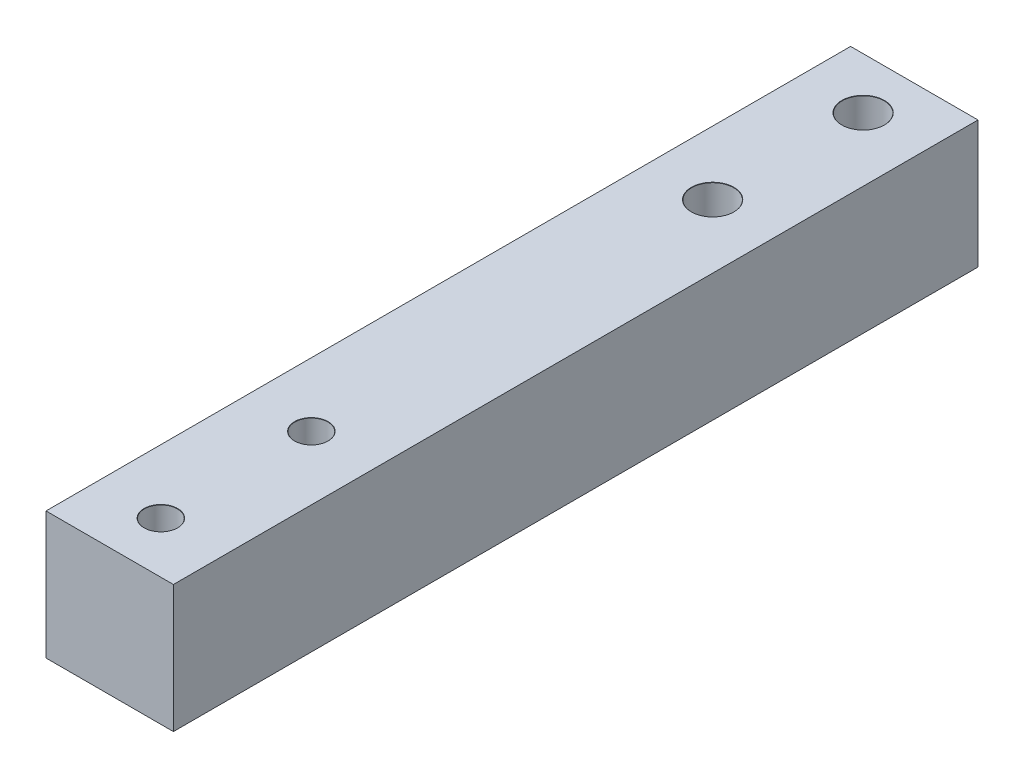
ISO-10303-21;
HEADER;
FILE_DESCRIPTION(('STEP AP214'),'2;1');
FILE_NAME('part.step','',(''),(''),'','','');
FILE_SCHEMA(('AUTOMOTIVE_DESIGN { 1 0 10303 214 1 1 1 1 }'));
ENDSEC;
DATA;
#1=APPLICATION_CONTEXT('core data for automotive mechanical design processes');
#2=APPLICATION_PROTOCOL_DEFINITION('international standard','automotive_design',2000,#1);
#3=PRODUCT_CONTEXT('',#1,'mechanical');
#4=PRODUCT('Part','Part','',(#3));
#5=PRODUCT_RELATED_PRODUCT_CATEGORY('part','',(#4));
#6=PRODUCT_DEFINITION_FORMATION('','',#4);
#7=PRODUCT_DEFINITION_CONTEXT('part definition',#1,'design');
#8=PRODUCT_DEFINITION('design','',#6,#7);
#9=PRODUCT_DEFINITION_SHAPE('','',#8);
#10=(LENGTH_UNIT() NAMED_UNIT(*) SI_UNIT(.MILLI.,.METRE.));
#11=(NAMED_UNIT(*) PLANE_ANGLE_UNIT() SI_UNIT($,.RADIAN.));
#12=(NAMED_UNIT(*) SI_UNIT($,.STERADIAN.) SOLID_ANGLE_UNIT());
#13=UNCERTAINTY_MEASURE_WITH_UNIT(LENGTH_MEASURE(1.E-05),#10,'distance_accuracy_value','');
#14=(GEOMETRIC_REPRESENTATION_CONTEXT(3) GLOBAL_UNCERTAINTY_ASSIGNED_CONTEXT((#13)) GLOBAL_UNIT_ASSIGNED_CONTEXT((#10,
#11,#12)) REPRESENTATION_CONTEXT('',''));
#15=CARTESIAN_POINT('',(0.,0.,0.));
#16=DIRECTION('',(0.,0.,1.));
#17=DIRECTION('',(1.,0.,0.));
#18=AXIS2_PLACEMENT_3D('',#15,#16,#17);
#19=CARTESIAN_POINT('',(-6.35,-6.35,80.2));
#20=DIRECTION('',(1.,0.,0.));
#21=DIRECTION('',(0.,0.,-1.));
#22=AXIS2_PLACEMENT_3D('',#19,#20,#21);
#23=PLANE('',#22);
#24=DIRECTION('',(0.,-1.,0.));
#25=VECTOR('',#24,1.);
#26=CARTESIAN_POINT('',(-6.35,-6.35,0.));
#27=LINE('',#26,#25);
#28=CARTESIAN_POINT('',(-6.35,6.35,0.));
#29=VERTEX_POINT('',#28);
#30=CARTESIAN_POINT('',(-6.35,-6.35,0.));
#31=VERTEX_POINT('',#30);
#32=EDGE_CURVE('E97',#29,#31,#27,.T.);
#33=ORIENTED_EDGE('',*,*,#32,.T.);
#34=DIRECTION('',(0.,0.,-1.));
#35=VECTOR('',#34,1.);
#36=CARTESIAN_POINT('',(-6.35,-6.35,80.2));
#37=LINE('',#36,#35);
#38=CARTESIAN_POINT('',(-6.35,-6.35,80.2));
#39=VERTEX_POINT('',#38);
#40=EDGE_CURVE('E11',#39,#31,#37,.T.);
#41=ORIENTED_EDGE('',*,*,#40,.F.);
#42=DIRECTION('',(0.,-1.,0.));
#43=VECTOR('',#42,1.);
#44=CARTESIAN_POINT('',(-6.35,-6.35,80.2));
#45=LINE('',#44,#43);
#46=CARTESIAN_POINT('',(-6.35,6.35,80.2));
#47=VERTEX_POINT('',#46);
#48=EDGE_CURVE('E85',#47,#39,#45,.T.);
#49=ORIENTED_EDGE('',*,*,#48,.F.);
#50=DIRECTION('',(0.,0.,-1.));
#51=VECTOR('',#50,1.);
#52=CARTESIAN_POINT('',(-6.35,6.35,80.2));
#53=LINE('',#52,#51);
#54=EDGE_CURVE('E93',#47,#29,#53,.T.);
#55=ORIENTED_EDGE('',*,*,#54,.T.);
#56=EDGE_LOOP('',(#33,#41,#49,#55));
#57=FACE_BOUND('',#56,.T.);
#58=ADVANCED_FACE('F34',(#57),#23,.F.);
#59=CARTESIAN_POINT('',(6.35,-6.35,80.2));
#60=DIRECTION('',(0.,1.,0.));
#61=DIRECTION('',(-1.,0.,0.));
#62=AXIS2_PLACEMENT_3D('',#59,#60,#61);
#63=PLANE('',#62);
#64=CARTESIAN_POINT('',(0.,-6.35,5.1));
#65=DIRECTION('',(0.,1.,0.));
#66=DIRECTION('',(0.,0.,1.));
#67=AXIS2_PLACEMENT_3D('',#64,#65,#66);
#68=CIRCLE('',#67,2.1);
#69=CARTESIAN_POINT('',(0.,-6.35,7.2));
#70=VERTEX_POINT('',#69);
#71=EDGE_CURVE('E137',#70,#70,#68,.T.);
#72=ORIENTED_EDGE('',*,*,#71,.T.);
#73=EDGE_LOOP('',(#72));
#74=FACE_BOUND('',#73,.T.);
#75=CARTESIAN_POINT('',(0.,-6.35,20.1));
#76=DIRECTION('',(0.,1.,0.));
#77=DIRECTION('',(0.,0.,1.));
#78=AXIS2_PLACEMENT_3D('',#75,#76,#77);
#79=CIRCLE('',#78,2.1);
#80=CARTESIAN_POINT('',(0.,-6.35,22.2));
#81=VERTEX_POINT('',#80);
#82=EDGE_CURVE('E128',#81,#81,#79,.T.);
#83=ORIENTED_EDGE('',*,*,#82,.T.);
#84=EDGE_LOOP('',(#83));
#85=FACE_BOUND('',#84,.T.);
#86=CARTESIAN_POINT('',(0.,-6.35,60.1));
#87=DIRECTION('',(0.,1.,0.));
#88=DIRECTION('',(0.,0.,1.));
#89=AXIS2_PLACEMENT_3D('',#86,#87,#88);
#90=CIRCLE('',#89,1.65);
#91=CARTESIAN_POINT('',(0.,-6.35,61.75));
#92=VERTEX_POINT('',#91);
#93=EDGE_CURVE('E119',#92,#92,#90,.T.);
#94=ORIENTED_EDGE('',*,*,#93,.T.);
#95=EDGE_LOOP('',(#94));
#96=FACE_BOUND('',#95,.T.);
#97=CARTESIAN_POINT('',(0.,-6.35,75.1));
#98=DIRECTION('',(0.,1.,0.));
#99=DIRECTION('',(0.,0.,1.));
#100=AXIS2_PLACEMENT_3D('',#97,#98,#99);
#101=CIRCLE('',#100,1.65);
#102=CARTESIAN_POINT('',(0.,-6.35,76.75));
#103=VERTEX_POINT('',#102);
#104=EDGE_CURVE('E100',#103,#103,#101,.T.);
#105=ORIENTED_EDGE('',*,*,#104,.T.);
#106=EDGE_LOOP('',(#105));
#107=FACE_BOUND('',#106,.T.);
#108=DIRECTION('',(1.,0.,0.));
#109=VECTOR('',#108,1.);
#110=CARTESIAN_POINT('',(6.35,-6.35,0.));
#111=LINE('',#110,#109);
#112=CARTESIAN_POINT('',(6.35,-6.35,0.));
#113=VERTEX_POINT('',#112);
#114=EDGE_CURVE('E89',#31,#113,#111,.T.);
#115=ORIENTED_EDGE('',*,*,#114,.T.);
#116=DIRECTION('',(0.,0.,-1.));
#117=VECTOR('',#116,1.);
#118=CARTESIAN_POINT('',(6.35,-6.35,80.2));
#119=LINE('',#118,#117);
#120=CARTESIAN_POINT('',(6.35,-6.35,80.2));
#121=VERTEX_POINT('',#120);
#122=EDGE_CURVE('E42',#121,#113,#119,.T.);
#123=ORIENTED_EDGE('',*,*,#122,.F.);
#124=DIRECTION('',(1.,0.,0.));
#125=VECTOR('',#124,1.);
#126=CARTESIAN_POINT('',(6.35,-6.35,80.2));
#127=LINE('',#126,#125);
#128=EDGE_CURVE('E80',#39,#121,#127,.T.);
#129=ORIENTED_EDGE('',*,*,#128,.F.);
#130=ORIENTED_EDGE('',*,*,#40,.T.);
#131=EDGE_LOOP('',(#115,#123,#129,#130));
#132=FACE_BOUND('',#131,.T.);
#133=ADVANCED_FACE('F88',(#74,#85,#96,#107,#132),#63,.F.);
#134=CARTESIAN_POINT('',(6.35,-6.35,80.2));
#135=DIRECTION('',(-1.,0.,0.));
#136=DIRECTION('',(0.,0.,1.));
#137=AXIS2_PLACEMENT_3D('',#134,#135,#136);
#138=PLANE('',#137);
#139=DIRECTION('',(0.,1.,0.));
#140=VECTOR('',#139,1.);
#141=CARTESIAN_POINT('',(6.35,-6.35,0.));
#142=LINE('',#141,#140);
#143=CARTESIAN_POINT('',(6.35,6.35,0.));
#144=VERTEX_POINT('',#143);
#145=EDGE_CURVE('E67',#113,#144,#142,.T.);
#146=ORIENTED_EDGE('',*,*,#145,.T.);
#147=DIRECTION('',(0.,0.,-1.));
#148=VECTOR('',#147,1.);
#149=CARTESIAN_POINT('',(6.35,6.35,80.2));
#150=LINE('',#149,#148);
#151=CARTESIAN_POINT('',(6.35,6.35,80.2));
#152=VERTEX_POINT('',#151);
#153=EDGE_CURVE('E90',#152,#144,#150,.T.);
#154=ORIENTED_EDGE('',*,*,#153,.F.);
#155=DIRECTION('',(0.,1.,0.));
#156=VECTOR('',#155,1.);
#157=CARTESIAN_POINT('',(6.35,-6.35,80.2));
#158=LINE('',#157,#156);
#159=EDGE_CURVE('E83',#121,#152,#158,.T.);
#160=ORIENTED_EDGE('',*,*,#159,.F.);
#161=ORIENTED_EDGE('',*,*,#122,.T.);
#162=EDGE_LOOP('',(#146,#154,#160,#161));
#163=FACE_BOUND('',#162,.T.);
#164=ADVANCED_FACE('F91',(#163),#138,.F.);
#165=CARTESIAN_POINT('',(6.35,6.35,80.2));
#166=DIRECTION('',(0.,-1.,0.));
#167=DIRECTION('',(1.,0.,0.));
#168=AXIS2_PLACEMENT_3D('',#165,#166,#167);
#169=PLANE('',#168);
#170=CARTESIAN_POINT('',(0.,6.35,5.1));
#171=DIRECTION('',(0.,1.,0.));
#172=DIRECTION('',(0.,0.,1.));
#173=AXIS2_PLACEMENT_3D('',#170,#171,#172);
#174=CIRCLE('',#173,2.125);
#175=CARTESIAN_POINT('',(0.,6.35,7.225));
#176=VERTEX_POINT('',#175);
#177=EDGE_CURVE('E143',#176,#176,#174,.T.);
#178=ORIENTED_EDGE('',*,*,#177,.F.);
#179=EDGE_LOOP('',(#178));
#180=FACE_BOUND('',#179,.T.);
#181=CARTESIAN_POINT('',(0.,6.35,20.1));
#182=DIRECTION('',(0.,1.,0.));
#183=DIRECTION('',(0.,0.,1.));
#184=AXIS2_PLACEMENT_3D('',#181,#182,#183);
#185=CIRCLE('',#184,2.125);
#186=CARTESIAN_POINT('',(0.,6.35,22.225));
#187=VERTEX_POINT('',#186);
#188=EDGE_CURVE('E134',#187,#187,#185,.T.);
#189=ORIENTED_EDGE('',*,*,#188,.F.);
#190=EDGE_LOOP('',(#189));
#191=FACE_BOUND('',#190,.T.);
#192=CARTESIAN_POINT('',(0.,6.35,60.1));
#193=DIRECTION('',(0.,1.,0.));
#194=DIRECTION('',(0.,0.,1.));
#195=AXIS2_PLACEMENT_3D('',#192,#193,#194);
#196=CIRCLE('',#195,1.675);
#197=CARTESIAN_POINT('',(0.,6.35,61.775));
#198=VERTEX_POINT('',#197);
#199=EDGE_CURVE('E125',#198,#198,#196,.T.);
#200=ORIENTED_EDGE('',*,*,#199,.F.);
#201=EDGE_LOOP('',(#200));
#202=FACE_BOUND('',#201,.T.);
#203=CARTESIAN_POINT('',(0.,6.35,75.1));
#204=DIRECTION('',(0.,1.,0.));
#205=DIRECTION('',(0.,0.,1.));
#206=AXIS2_PLACEMENT_3D('',#203,#204,#205);
#207=CIRCLE('',#206,1.675);
#208=CARTESIAN_POINT('',(0.,6.35,76.775));
#209=VERTEX_POINT('',#208);
#210=EDGE_CURVE('E116',#209,#209,#207,.T.);
#211=ORIENTED_EDGE('',*,*,#210,.F.);
#212=EDGE_LOOP('',(#211));
#213=FACE_BOUND('',#212,.T.);
#214=DIRECTION('',(-1.,0.,0.));
#215=VECTOR('',#214,1.);
#216=CARTESIAN_POINT('',(6.35,6.35,0.));
#217=LINE('',#216,#215);
#218=EDGE_CURVE('E73',#144,#29,#217,.T.);
#219=ORIENTED_EDGE('',*,*,#218,.T.);
#220=ORIENTED_EDGE('',*,*,#54,.F.);
#221=DIRECTION('',(-1.,0.,0.));
#222=VECTOR('',#221,1.);
#223=CARTESIAN_POINT('',(6.35,6.35,80.2));
#224=LINE('',#223,#222);
#225=EDGE_CURVE('E50',#152,#47,#224,.T.);
#226=ORIENTED_EDGE('',*,*,#225,.F.);
#227=ORIENTED_EDGE('',*,*,#153,.T.);
#228=EDGE_LOOP('',(#219,#220,#226,#227));
#229=FACE_BOUND('',#228,.T.);
#230=ADVANCED_FACE('F105',(#180,#191,#202,#213,#229),#169,.F.);
#231=CARTESIAN_POINT('',(0.,0.,80.2));
#232=DIRECTION('',(0.,0.,1.));
#233=DIRECTION('',(1.,0.,0.));
#234=AXIS2_PLACEMENT_3D('',#231,#232,#233);
#235=PLANE('',#234);
#236=ORIENTED_EDGE('',*,*,#48,.T.);
#237=ORIENTED_EDGE('',*,*,#128,.T.);
#238=ORIENTED_EDGE('',*,*,#159,.T.);
#239=ORIENTED_EDGE('',*,*,#225,.T.);
#240=EDGE_LOOP('',(#236,#237,#238,#239));
#241=FACE_BOUND('',#240,.T.);
#242=ADVANCED_FACE('F81',(#241),#235,.T.);
#243=CARTESIAN_POINT('',(0.,0.,0.));
#244=DIRECTION('',(0.,0.,1.));
#245=DIRECTION('',(1.,0.,0.));
#246=AXIS2_PLACEMENT_3D('',#243,#244,#245);
#247=PLANE('',#246);
#248=ORIENTED_EDGE('',*,*,#32,.F.);
#249=ORIENTED_EDGE('',*,*,#218,.F.);
#250=ORIENTED_EDGE('',*,*,#145,.F.);
#251=ORIENTED_EDGE('',*,*,#114,.F.);
#252=EDGE_LOOP('',(#248,#249,#250,#251));
#253=FACE_BOUND('',#252,.T.);
#254=ADVANCED_FACE('F108',(#253),#247,.F.);
#255=CARTESIAN_POINT('',(0.,6.35,75.1));
#256=DIRECTION('',(0.,1.,0.));
#257=DIRECTION('',(0.,0.,1.));
#258=AXIS2_PLACEMENT_3D('',#255,#256,#257);
#259=CYLINDRICAL_SURFACE('',#258,1.65);
#260=ORIENTED_EDGE('',*,*,#104,.F.);
#261=EDGE_LOOP('',(#260));
#262=FACE_BOUND('',#261,.T.);
#263=CARTESIAN_POINT('',(0.,6.325,75.1));
#264=DIRECTION('',(0.,1.,0.));
#265=DIRECTION('',(0.,0.,1.));
#266=AXIS2_PLACEMENT_3D('',#263,#264,#265);
#267=CIRCLE('',#266,1.65);
#268=CARTESIAN_POINT('',(0.,6.325,76.75));
#269=VERTEX_POINT('',#268);
#270=EDGE_CURVE('E113',#269,#269,#267,.T.);
#271=ORIENTED_EDGE('',*,*,#270,.T.);
#272=EDGE_LOOP('',(#271));
#273=FACE_BOUND('',#272,.T.);
#274=ADVANCED_FACE('F161',(#262,#273),#259,.F.);
#275=CARTESIAN_POINT('',(0.,6.35,75.1));
#276=DIRECTION('',(0.,1.,0.));
#277=DIRECTION('',(0.,0.,1.));
#278=AXIS2_PLACEMENT_3D('',#275,#276,#277);
#279=CONICAL_SURFACE('',#278,1.675,0.785398163397414);
#280=ORIENTED_EDGE('',*,*,#270,.F.);
#281=EDGE_LOOP('',(#280));
#282=FACE_BOUND('',#281,.T.);
#283=ORIENTED_EDGE('',*,*,#210,.T.);
#284=EDGE_LOOP('',(#283));
#285=FACE_BOUND('',#284,.T.);
#286=ADVANCED_FACE('F158',(#282,#285),#279,.F.);
#287=CARTESIAN_POINT('',(0.,6.35,60.1));
#288=DIRECTION('',(0.,1.,0.));
#289=DIRECTION('',(0.,0.,1.));
#290=AXIS2_PLACEMENT_3D('',#287,#288,#289);
#291=CYLINDRICAL_SURFACE('',#290,1.65);
#292=ORIENTED_EDGE('',*,*,#93,.F.);
#293=EDGE_LOOP('',(#292));
#294=FACE_BOUND('',#293,.T.);
#295=CARTESIAN_POINT('',(0.,6.325,60.1));
#296=DIRECTION('',(0.,1.,0.));
#297=DIRECTION('',(0.,0.,1.));
#298=AXIS2_PLACEMENT_3D('',#295,#296,#297);
#299=CIRCLE('',#298,1.65);
#300=CARTESIAN_POINT('',(0.,6.325,61.75));
#301=VERTEX_POINT('',#300);
#302=EDGE_CURVE('E122',#301,#301,#299,.T.);
#303=ORIENTED_EDGE('',*,*,#302,.T.);
#304=EDGE_LOOP('',(#303));
#305=FACE_BOUND('',#304,.T.);
#306=ADVANCED_FACE('F160',(#294,#305),#291,.F.);
#307=CARTESIAN_POINT('',(0.,6.35,60.1));
#308=DIRECTION('',(0.,1.,0.));
#309=DIRECTION('',(0.,0.,1.));
#310=AXIS2_PLACEMENT_3D('',#307,#308,#309);
#311=CONICAL_SURFACE('',#310,1.675,0.785398163397414);
#312=ORIENTED_EDGE('',*,*,#302,.F.);
#313=EDGE_LOOP('',(#312));
#314=FACE_BOUND('',#313,.T.);
#315=ORIENTED_EDGE('',*,*,#199,.T.);
#316=EDGE_LOOP('',(#315));
#317=FACE_BOUND('',#316,.T.);
#318=ADVANCED_FACE('F168',(#314,#317),#311,.F.);
#319=CARTESIAN_POINT('',(0.,6.35,20.1));
#320=DIRECTION('',(0.,1.,0.));
#321=DIRECTION('',(0.,0.,1.));
#322=AXIS2_PLACEMENT_3D('',#319,#320,#321);
#323=CYLINDRICAL_SURFACE('',#322,2.1);
#324=ORIENTED_EDGE('',*,*,#82,.F.);
#325=EDGE_LOOP('',(#324));
#326=FACE_BOUND('',#325,.T.);
#327=CARTESIAN_POINT('',(0.,6.32499999999999,20.1));
#328=DIRECTION('',(0.,1.,0.));
#329=DIRECTION('',(0.,0.,1.));
#330=AXIS2_PLACEMENT_3D('',#327,#328,#329);
#331=CIRCLE('',#330,2.1);
#332=CARTESIAN_POINT('',(0.,6.32499999999999,22.2));
#333=VERTEX_POINT('',#332);
#334=EDGE_CURVE('E131',#333,#333,#331,.T.);
#335=ORIENTED_EDGE('',*,*,#334,.T.);
#336=EDGE_LOOP('',(#335));
#337=FACE_BOUND('',#336,.T.);
#338=ADVANCED_FACE('F219',(#326,#337),#323,.F.);
#339=CARTESIAN_POINT('',(0.,6.35,20.1));
#340=DIRECTION('',(0.,1.,0.));
#341=DIRECTION('',(0.,0.,1.));
#342=AXIS2_PLACEMENT_3D('',#339,#340,#341);
#343=CONICAL_SURFACE('',#342,2.125,0.785398163397388);
#344=ORIENTED_EDGE('',*,*,#334,.F.);
#345=EDGE_LOOP('',(#344));
#346=FACE_BOUND('',#345,.T.);
#347=ORIENTED_EDGE('',*,*,#188,.T.);
#348=EDGE_LOOP('',(#347));
#349=FACE_BOUND('',#348,.T.);
#350=ADVANCED_FACE('F240',(#346,#349),#343,.F.);
#351=CARTESIAN_POINT('',(0.,6.35,5.1));
#352=DIRECTION('',(0.,1.,0.));
#353=DIRECTION('',(0.,0.,1.));
#354=AXIS2_PLACEMENT_3D('',#351,#352,#353);
#355=CYLINDRICAL_SURFACE('',#354,2.1);
#356=ORIENTED_EDGE('',*,*,#71,.F.);
#357=EDGE_LOOP('',(#356));
#358=FACE_BOUND('',#357,.T.);
#359=CARTESIAN_POINT('',(0.,6.32499999999999,5.1));
#360=DIRECTION('',(0.,1.,0.));
#361=DIRECTION('',(0.,0.,1.));
#362=AXIS2_PLACEMENT_3D('',#359,#360,#361);
#363=CIRCLE('',#362,2.1);
#364=CARTESIAN_POINT('',(0.,6.32499999999999,7.2));
#365=VERTEX_POINT('',#364);
#366=EDGE_CURVE('E140',#365,#365,#363,.T.);
#367=ORIENTED_EDGE('',*,*,#366,.T.);
#368=EDGE_LOOP('',(#367));
#369=FACE_BOUND('',#368,.T.);
#370=ADVANCED_FACE('F250',(#358,#369),#355,.F.);
#371=CARTESIAN_POINT('',(0.,6.35,5.1));
#372=DIRECTION('',(0.,1.,0.));
#373=DIRECTION('',(0.,0.,1.));
#374=AXIS2_PLACEMENT_3D('',#371,#372,#373);
#375=CONICAL_SURFACE('',#374,2.125,0.785398163397388);
#376=ORIENTED_EDGE('',*,*,#366,.F.);
#377=EDGE_LOOP('',(#376));
#378=FACE_BOUND('',#377,.T.);
#379=ORIENTED_EDGE('',*,*,#177,.T.);
#380=EDGE_LOOP('',(#379));
#381=FACE_BOUND('',#380,.T.);
#382=ADVANCED_FACE('F147',(#378,#381),#375,.F.);
#383=CLOSED_SHELL('',(#58,#133,#164,#230,#242,#254,#274,#286,#306,#318,#338,#350,#370,#382));
#384=MANIFOLD_SOLID_BREP('B2',#383);
#385=ADVANCED_BREP_SHAPE_REPRESENTATION('',(#18,#384),#14);
#386=SHAPE_DEFINITION_REPRESENTATION(#9,#385);
ENDSEC;
END-ISO-10303-21;
